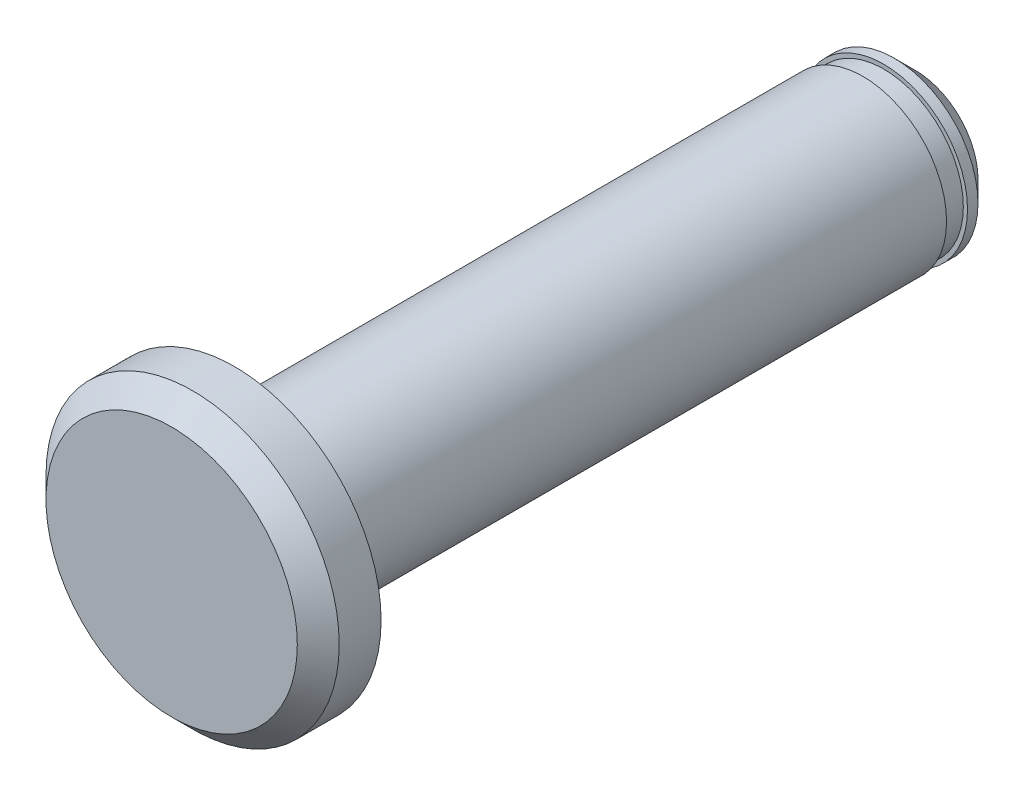
ISO-10303-21;
HEADER;
FILE_DESCRIPTION(('STEP AP214'),'2;1');
FILE_NAME('part.step','',(''),(''),'','','');
FILE_SCHEMA(('AUTOMOTIVE_DESIGN { 1 0 10303 214 1 1 1 1 }'));
ENDSEC;
DATA;
#1=APPLICATION_CONTEXT('core data for automotive mechanical design processes');
#2=APPLICATION_PROTOCOL_DEFINITION('international standard','automotive_design',2000,#1);
#3=PRODUCT_CONTEXT('',#1,'mechanical');
#4=PRODUCT('Part','Part','',(#3));
#5=PRODUCT_RELATED_PRODUCT_CATEGORY('part','',(#4));
#6=PRODUCT_DEFINITION_FORMATION('','',#4);
#7=PRODUCT_DEFINITION_CONTEXT('part definition',#1,'design');
#8=PRODUCT_DEFINITION('design','',#6,#7);
#9=PRODUCT_DEFINITION_SHAPE('','',#8);
#10=(LENGTH_UNIT() NAMED_UNIT(*) SI_UNIT(.MILLI.,.METRE.));
#11=(NAMED_UNIT(*) PLANE_ANGLE_UNIT() SI_UNIT($,.RADIAN.));
#12=(NAMED_UNIT(*) SI_UNIT($,.STERADIAN.) SOLID_ANGLE_UNIT());
#13=UNCERTAINTY_MEASURE_WITH_UNIT(LENGTH_MEASURE(1.E-05),#10,'distance_accuracy_value','');
#14=(GEOMETRIC_REPRESENTATION_CONTEXT(3) GLOBAL_UNCERTAINTY_ASSIGNED_CONTEXT((#13)) GLOBAL_UNIT_ASSIGNED_CONTEXT((#10,
#11,#12)) REPRESENTATION_CONTEXT('',''));
#15=CARTESIAN_POINT('',(0.,0.,0.));
#16=DIRECTION('',(0.,0.,1.));
#17=DIRECTION('',(1.,0.,0.));
#18=AXIS2_PLACEMENT_3D('',#15,#16,#17);
#19=CARTESIAN_POINT('',(-16.6807803033331,0.,40.5991607218808));
#20=DIRECTION('',(0.,0.,1.));
#21=DIRECTION('',(1.,0.,0.));
#22=AXIS2_PLACEMENT_3D('',#19,#20,#21);
#23=PLANE('',#22);
#24=CARTESIAN_POINT('',(-12.6807803033331,0.,40.5991607218808));
#25=DIRECTION('',(0.,0.,1.));
#26=DIRECTION('',(1.,0.,0.));
#27=AXIS2_PLACEMENT_3D('',#24,#25,#26);
#28=CIRCLE('',#27,7.);
#29=CARTESIAN_POINT('',(-5.68078030333309,0.,40.5991607218808));
#30=VERTEX_POINT('',#29);
#31=EDGE_CURVE('E36',#30,#30,#28,.T.);
#32=ORIENTED_EDGE('',*,*,#31,.F.);
#33=EDGE_LOOP('',(#32));
#34=FACE_BOUND('',#33,.T.);
#35=CARTESIAN_POINT('',(-12.6807803033331,0.,40.5991607218808));
#36=DIRECTION('',(0.,0.,1.));
#37=DIRECTION('',(1.,0.,0.));
#38=AXIS2_PLACEMENT_3D('',#35,#36,#37);
#39=CIRCLE('',#38,4.00000000000004);
#40=CARTESIAN_POINT('',(-8.68078030333305,0.,40.5991607218808));
#41=VERTEX_POINT('',#40);
#42=EDGE_CURVE('E10',#41,#41,#39,.T.);
#43=ORIENTED_EDGE('',*,*,#42,.T.);
#44=EDGE_LOOP('',(#43));
#45=FACE_BOUND('',#44,.T.);
#46=ADVANCED_FACE('F30',(#34,#45),#23,.F.);
#47=CARTESIAN_POINT('',(-12.6807803033331,0.,67.5379149103779));
#48=DIRECTION('',(0.,0.,1.));
#49=DIRECTION('',(1.,0.,0.));
#50=AXIS2_PLACEMENT_3D('',#47,#48,#49);
#51=CYLINDRICAL_SURFACE('',#50,7.);
#52=CARTESIAN_POINT('',(-12.6807803033331,0.,42.5991607218808));
#53=DIRECTION('',(0.,0.,1.));
#54=DIRECTION('',(1.,0.,0.));
#55=AXIS2_PLACEMENT_3D('',#52,#53,#54);
#56=CIRCLE('',#55,7.);
#57=CARTESIAN_POINT('',(-5.6807803033331,0.,42.5991607218808));
#58=VERTEX_POINT('',#57);
#59=EDGE_CURVE('E40',#58,#58,#56,.T.);
#60=ORIENTED_EDGE('',*,*,#59,.F.);
#61=EDGE_LOOP('',(#60));
#62=FACE_BOUND('',#61,.T.);
#63=ORIENTED_EDGE('',*,*,#31,.T.);
#64=EDGE_LOOP('',(#63));
#65=FACE_BOUND('',#64,.T.);
#66=ADVANCED_FACE('F85',(#62,#65),#51,.T.);
#67=CARTESIAN_POINT('',(-12.6807803033331,0.,42.5991607218808));
#68=DIRECTION('',(0.,0.,-1.));
#69=DIRECTION('',(-1.,0.,0.));
#70=AXIS2_PLACEMENT_3D('',#67,#68,#69);
#71=CONICAL_SURFACE('',#70,7.,0.785398163397447);
#72=CARTESIAN_POINT('',(-12.6807803033331,0.,43.5991607218808));
#73=DIRECTION('',(0.,0.,1.));
#74=DIRECTION('',(1.,0.,0.));
#75=AXIS2_PLACEMENT_3D('',#72,#73,#74);
#76=CIRCLE('',#75,6.);
#77=CARTESIAN_POINT('',(-6.68078030333309,0.,43.5991607218808));
#78=VERTEX_POINT('',#77);
#79=EDGE_CURVE('E44',#78,#78,#76,.T.);
#80=ORIENTED_EDGE('',*,*,#79,.F.);
#81=EDGE_LOOP('',(#80));
#82=FACE_BOUND('',#81,.T.);
#83=ORIENTED_EDGE('',*,*,#59,.T.);
#84=EDGE_LOOP('',(#83));
#85=FACE_BOUND('',#84,.T.);
#86=ADVANCED_FACE('F90',(#82,#85),#71,.T.);
#87=CARTESIAN_POINT('',(-18.6807803033331,0.,43.5991607218808));
#88=DIRECTION('',(0.,0.,-1.));
#89=DIRECTION('',(-1.,0.,0.));
#90=AXIS2_PLACEMENT_3D('',#87,#88,#89);
#91=PLANE('',#90);
#92=ORIENTED_EDGE('',*,*,#79,.T.);
#93=EDGE_LOOP('',(#92));
#94=FACE_BOUND('',#93,.T.);
#95=ADVANCED_FACE('F95',(#94),#91,.F.);
#96=CARTESIAN_POINT('',(-15.6807803033331,0.,8.09916072188076));
#97=DIRECTION('',(0.,0.,-1.));
#98=DIRECTION('',(-1.,0.,0.));
#99=AXIS2_PLACEMENT_3D('',#96,#97,#98);
#100=PLANE('',#99);
#101=CARTESIAN_POINT('',(-12.6807803033331,0.,8.09916072188076));
#102=DIRECTION('',(0.,0.,1.));
#103=DIRECTION('',(1.,0.,0.));
#104=AXIS2_PLACEMENT_3D('',#101,#102,#103);
#105=CIRCLE('',#104,3.);
#106=CARTESIAN_POINT('',(-9.68078030333309,0.,8.09916072188076));
#107=VERTEX_POINT('',#106);
#108=EDGE_CURVE('E49',#107,#107,#105,.T.);
#109=ORIENTED_EDGE('',*,*,#108,.F.);
#110=EDGE_LOOP('',(#109));
#111=FACE_BOUND('',#110,.T.);
#112=ADVANCED_FACE('F102',(#111),#100,.T.);
#113=CARTESIAN_POINT('',(-12.6807803033331,0.,9.09916072188077));
#114=DIRECTION('',(0.,0.,1.));
#115=DIRECTION('',(1.,0.,0.));
#116=AXIS2_PLACEMENT_3D('',#113,#114,#115);
#117=CONICAL_SURFACE('',#116,4.,0.785398163397445);
#118=ORIENTED_EDGE('',*,*,#108,.T.);
#119=EDGE_LOOP('',(#118));
#120=FACE_BOUND('',#119,.T.);
#121=CARTESIAN_POINT('',(-12.6807803033331,0.,9.09916072188077));
#122=DIRECTION('',(0.,0.,1.));
#123=DIRECTION('',(1.,0.,0.));
#124=AXIS2_PLACEMENT_3D('',#121,#122,#123);
#125=CIRCLE('',#124,4.);
#126=CARTESIAN_POINT('',(-8.68078030333309,0.,9.09916072188077));
#127=VERTEX_POINT('',#126);
#128=EDGE_CURVE('E52',#127,#127,#125,.T.);
#129=ORIENTED_EDGE('',*,*,#128,.F.);
#130=EDGE_LOOP('',(#129));
#131=FACE_BOUND('',#130,.T.);
#132=ADVANCED_FACE('F106',(#120,#131),#117,.T.);
#133=CARTESIAN_POINT('',(-12.6807803033331,0.,67.5379149103779));
#134=DIRECTION('',(0.,0.,1.));
#135=DIRECTION('',(1.,0.,0.));
#136=AXIS2_PLACEMENT_3D('',#133,#134,#135);
#137=CYLINDRICAL_SURFACE('',#136,4.);
#138=ORIENTED_EDGE('',*,*,#128,.T.);
#139=EDGE_LOOP('',(#138));
#140=FACE_BOUND('',#139,.T.);
#141=CARTESIAN_POINT('',(-12.6807803033331,0.,9.59916072188077));
#142=DIRECTION('',(0.,0.,1.));
#143=DIRECTION('',(1.,0.,0.));
#144=AXIS2_PLACEMENT_3D('',#141,#142,#143);
#145=CIRCLE('',#144,4.);
#146=CARTESIAN_POINT('',(-8.68078030333309,0.,9.59916072188077));
#147=VERTEX_POINT('',#146);
#148=EDGE_CURVE('E55',#147,#147,#145,.T.);
#149=ORIENTED_EDGE('',*,*,#148,.F.);
#150=EDGE_LOOP('',(#149));
#151=FACE_BOUND('',#150,.T.);
#152=ADVANCED_FACE('F110',(#140,#151),#137,.T.);
#153=CARTESIAN_POINT('',(-16.4807803033331,0.,9.59916072188077));
#154=DIRECTION('',(0.,0.,1.));
#155=DIRECTION('',(1.,0.,0.));
#156=AXIS2_PLACEMENT_3D('',#153,#154,#155);
#157=PLANE('',#156);
#158=ORIENTED_EDGE('',*,*,#148,.T.);
#159=EDGE_LOOP('',(#158));
#160=FACE_BOUND('',#159,.T.);
#161=CARTESIAN_POINT('',(-12.6807803033331,0.,9.59916072188077));
#162=DIRECTION('',(0.,0.,1.));
#163=DIRECTION('',(1.,0.,0.));
#164=AXIS2_PLACEMENT_3D('',#161,#162,#163);
#165=CIRCLE('',#164,3.8);
#166=CARTESIAN_POINT('',(-8.88078030333309,0.,9.59916072188077));
#167=VERTEX_POINT('',#166);
#168=EDGE_CURVE('E58',#167,#167,#165,.T.);
#169=ORIENTED_EDGE('',*,*,#168,.F.);
#170=EDGE_LOOP('',(#169));
#171=FACE_BOUND('',#170,.T.);
#172=ADVANCED_FACE('F81',(#160,#171),#157,.T.);
#173=CARTESIAN_POINT('',(-12.6807803033331,0.,67.5379149103779));
#174=DIRECTION('',(0.,0.,1.));
#175=DIRECTION('',(1.,0.,0.));
#176=AXIS2_PLACEMENT_3D('',#173,#174,#175);
#177=CYLINDRICAL_SURFACE('',#176,3.8);
#178=ORIENTED_EDGE('',*,*,#168,.T.);
#179=EDGE_LOOP('',(#178));
#180=FACE_BOUND('',#179,.T.);
#181=CARTESIAN_POINT('',(-12.6807803033331,0.,10.5991607218808));
#182=DIRECTION('',(0.,0.,1.));
#183=DIRECTION('',(1.,0.,0.));
#184=AXIS2_PLACEMENT_3D('',#181,#182,#183);
#185=CIRCLE('',#184,3.79999999999999);
#186=CARTESIAN_POINT('',(-8.8807803033331,0.,10.5991607218808));
#187=VERTEX_POINT('',#186);
#188=EDGE_CURVE('E61',#187,#187,#185,.T.);
#189=ORIENTED_EDGE('',*,*,#188,.F.);
#190=EDGE_LOOP('',(#189));
#191=FACE_BOUND('',#190,.T.);
#192=ADVANCED_FACE('F72',(#180,#191),#177,.T.);
#193=CARTESIAN_POINT('',(-16.6807803033331,0.,10.5991607218808));
#194=DIRECTION('',(0.,0.,-1.));
#195=DIRECTION('',(-1.,0.,0.));
#196=AXIS2_PLACEMENT_3D('',#193,#194,#195);
#197=PLANE('',#196);
#198=ORIENTED_EDGE('',*,*,#188,.T.);
#199=EDGE_LOOP('',(#198));
#200=FACE_BOUND('',#199,.T.);
#201=CARTESIAN_POINT('',(-12.6807803033331,0.,10.5991607218808));
#202=DIRECTION('',(0.,0.,1.));
#203=DIRECTION('',(1.,0.,0.));
#204=AXIS2_PLACEMENT_3D('',#201,#202,#203);
#205=CIRCLE('',#204,4.);
#206=CARTESIAN_POINT('',(-8.68078030333309,0.,10.5991607218808));
#207=VERTEX_POINT('',#206);
#208=EDGE_CURVE('E64',#207,#207,#205,.T.);
#209=ORIENTED_EDGE('',*,*,#208,.F.);
#210=EDGE_LOOP('',(#209));
#211=FACE_BOUND('',#210,.T.);
#212=ADVANCED_FACE('F70',(#200,#211),#197,.T.);
#213=CARTESIAN_POINT('',(-12.6807803033331,0.,67.5379149103779));
#214=DIRECTION('',(0.,0.,1.));
#215=DIRECTION('',(1.,0.,0.));
#216=AXIS2_PLACEMENT_3D('',#213,#214,#215);
#217=CYLINDRICAL_SURFACE('',#216,4.);
#218=ORIENTED_EDGE('',*,*,#42,.F.);
#219=EDGE_LOOP('',(#218));
#220=FACE_BOUND('',#219,.T.);
#221=ORIENTED_EDGE('',*,*,#208,.T.);
#222=EDGE_LOOP('',(#221));
#223=FACE_BOUND('',#222,.T.);
#224=ADVANCED_FACE('F68',(#220,#223),#217,.T.);
#225=CLOSED_SHELL('',(#46,#66,#86,#95,#112,#132,#152,#172,#192,#212,#224));
#226=MANIFOLD_SOLID_BREP('B2',#225);
#227=ADVANCED_BREP_SHAPE_REPRESENTATION('',(#18,#226),#14);
#228=SHAPE_DEFINITION_REPRESENTATION(#9,#227);
ENDSEC;
END-ISO-10303-21;
